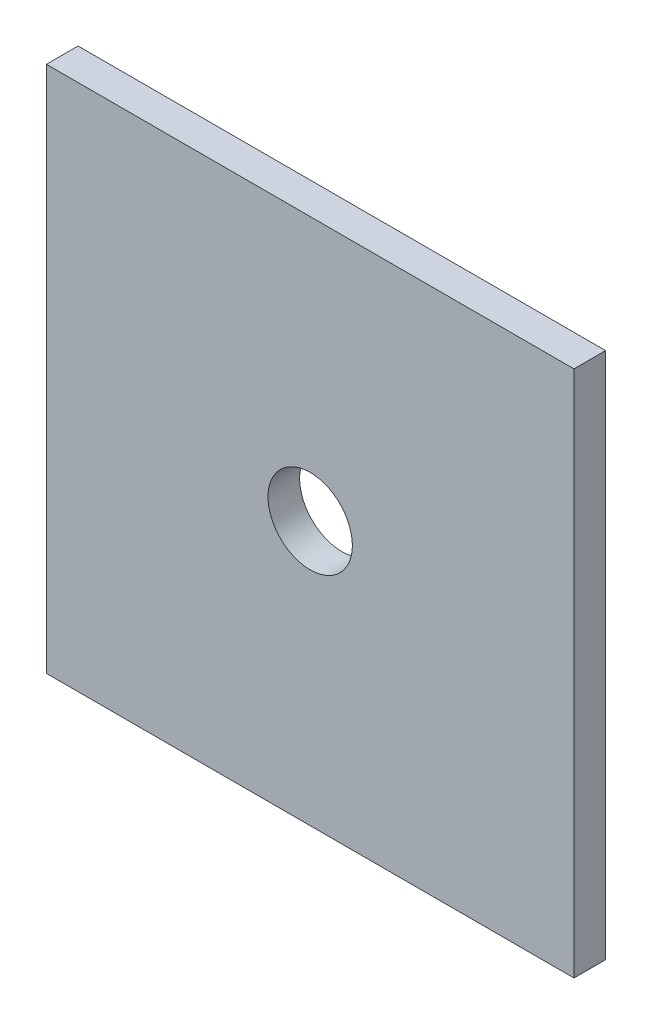
ISO-10303-21;
HEADER;
FILE_DESCRIPTION(('STEP AP214'),'2;1');
FILE_NAME('part.step','',(''),(''),'','','');
FILE_SCHEMA(('AUTOMOTIVE_DESIGN { 1 0 10303 214 1 1 1 1 }'));
ENDSEC;
DATA;
#1=APPLICATION_CONTEXT('core data for automotive mechanical design processes');
#2=APPLICATION_PROTOCOL_DEFINITION('international standard','automotive_design',2000,#1);
#3=PRODUCT_CONTEXT('',#1,'mechanical');
#4=PRODUCT('Part','Part','',(#3));
#5=PRODUCT_RELATED_PRODUCT_CATEGORY('part','',(#4));
#6=PRODUCT_DEFINITION_FORMATION('','',#4);
#7=PRODUCT_DEFINITION_CONTEXT('part definition',#1,'design');
#8=PRODUCT_DEFINITION('design','',#6,#7);
#9=PRODUCT_DEFINITION_SHAPE('','',#8);
#10=(LENGTH_UNIT() NAMED_UNIT(*) SI_UNIT(.MILLI.,.METRE.));
#11=(NAMED_UNIT(*) PLANE_ANGLE_UNIT() SI_UNIT($,.RADIAN.));
#12=(NAMED_UNIT(*) SI_UNIT($,.STERADIAN.) SOLID_ANGLE_UNIT());
#13=UNCERTAINTY_MEASURE_WITH_UNIT(LENGTH_MEASURE(1.E-05),#10,'distance_accuracy_value','');
#14=(GEOMETRIC_REPRESENTATION_CONTEXT(3) GLOBAL_UNCERTAINTY_ASSIGNED_CONTEXT((#13)) GLOBAL_UNIT_ASSIGNED_CONTEXT((#10,
#11,#12)) REPRESENTATION_CONTEXT('',''));
#15=CARTESIAN_POINT('',(0.,0.,0.));
#16=DIRECTION('',(0.,0.,1.));
#17=DIRECTION('',(1.,0.,0.));
#18=AXIS2_PLACEMENT_3D('',#15,#16,#17);
#19=CARTESIAN_POINT('',(0.,0.,3.));
#20=DIRECTION('',(0.,0.,-1.));
#21=DIRECTION('',(-1.,0.,0.));
#22=AXIS2_PLACEMENT_3D('',#19,#20,#21);
#23=PLANE('',#22);
#24=DIRECTION('',(0.,1.,0.));
#25=VECTOR('',#24,1.);
#26=CARTESIAN_POINT('',(25.,-25.,3.));
#27=LINE('',#26,#25);
#28=CARTESIAN_POINT('',(25.,-25.,3.));
#29=VERTEX_POINT('',#28);
#30=CARTESIAN_POINT('',(25.,25.,3.));
#31=VERTEX_POINT('',#30);
#32=EDGE_CURVE('E84',#29,#31,#27,.T.);
#33=ORIENTED_EDGE('',*,*,#32,.T.);
#34=DIRECTION('',(-1.,0.,0.));
#35=VECTOR('',#34,1.);
#36=CARTESIAN_POINT('',(-25.,25.,3.));
#37=LINE('',#36,#35);
#38=CARTESIAN_POINT('',(-25.,25.,3.));
#39=VERTEX_POINT('',#38);
#40=EDGE_CURVE('E79',#31,#39,#37,.T.);
#41=ORIENTED_EDGE('',*,*,#40,.T.);
#42=DIRECTION('',(0.,-1.,0.));
#43=VECTOR('',#42,1.);
#44=CARTESIAN_POINT('',(-25.,-25.,3.));
#45=LINE('',#44,#43);
#46=CARTESIAN_POINT('',(-25.,-25.,3.));
#47=VERTEX_POINT('',#46);
#48=EDGE_CURVE('E82',#39,#47,#45,.T.);
#49=ORIENTED_EDGE('',*,*,#48,.T.);
#50=DIRECTION('',(1.,0.,0.));
#51=VECTOR('',#50,1.);
#52=CARTESIAN_POINT('',(-25.,-25.,3.));
#53=LINE('',#52,#51);
#54=EDGE_CURVE('E49',#47,#29,#53,.T.);
#55=ORIENTED_EDGE('',*,*,#54,.T.);
#56=EDGE_LOOP('',(#33,#41,#49,#55));
#57=FACE_BOUND('',#56,.T.);
#58=CARTESIAN_POINT('',(0.,0.,3.));
#59=DIRECTION('',(0.,0.,1.));
#60=DIRECTION('',(1.,0.,0.));
#61=AXIS2_PLACEMENT_3D('',#58,#59,#60);
#62=CIRCLE('',#61,4.);
#63=CARTESIAN_POINT('',(4.,0.,3.));
#64=VERTEX_POINT('',#63);
#65=EDGE_CURVE('E99',#64,#64,#62,.T.);
#66=ORIENTED_EDGE('',*,*,#65,.F.);
#67=EDGE_LOOP('',(#66));
#68=FACE_BOUND('',#67,.T.);
#69=ADVANCED_FACE('F32',(#57,#68),#23,.F.);
#70=CARTESIAN_POINT('',(0.,0.,0.));
#71=DIRECTION('',(0.,0.,-1.));
#72=DIRECTION('',(-1.,0.,0.));
#73=AXIS2_PLACEMENT_3D('',#70,#71,#72);
#74=PLANE('',#73);
#75=DIRECTION('',(0.,1.,0.));
#76=VECTOR('',#75,1.);
#77=CARTESIAN_POINT('',(25.,-25.,0.));
#78=LINE('',#77,#76);
#79=CARTESIAN_POINT('',(25.,-25.,0.));
#80=VERTEX_POINT('',#79);
#81=CARTESIAN_POINT('',(25.,25.,0.));
#82=VERTEX_POINT('',#81);
#83=EDGE_CURVE('E96',#80,#82,#78,.T.);
#84=ORIENTED_EDGE('',*,*,#83,.F.);
#85=DIRECTION('',(1.,0.,0.));
#86=VECTOR('',#85,1.);
#87=CARTESIAN_POINT('',(-25.,-25.,0.));
#88=LINE('',#87,#86);
#89=CARTESIAN_POINT('',(-25.,-25.,0.));
#90=VERTEX_POINT('',#89);
#91=EDGE_CURVE('E72',#90,#80,#88,.T.);
#92=ORIENTED_EDGE('',*,*,#91,.F.);
#93=DIRECTION('',(0.,-1.,0.));
#94=VECTOR('',#93,1.);
#95=CARTESIAN_POINT('',(-25.,-25.,0.));
#96=LINE('',#95,#94);
#97=CARTESIAN_POINT('',(-25.,25.,0.));
#98=VERTEX_POINT('',#97);
#99=EDGE_CURVE('E66',#98,#90,#96,.T.);
#100=ORIENTED_EDGE('',*,*,#99,.F.);
#101=DIRECTION('',(-1.,0.,0.));
#102=VECTOR('',#101,1.);
#103=CARTESIAN_POINT('',(-25.,25.,0.));
#104=LINE('',#103,#102);
#105=EDGE_CURVE('E88',#82,#98,#104,.T.);
#106=ORIENTED_EDGE('',*,*,#105,.F.);
#107=EDGE_LOOP('',(#84,#92,#100,#106));
#108=FACE_BOUND('',#107,.T.);
#109=CARTESIAN_POINT('',(0.,0.,0.));
#110=DIRECTION('',(0.,0.,1.));
#111=DIRECTION('',(1.,0.,0.));
#112=AXIS2_PLACEMENT_3D('',#109,#110,#111);
#113=CIRCLE('',#112,4.);
#114=CARTESIAN_POINT('',(4.,0.,0.));
#115=VERTEX_POINT('',#114);
#116=EDGE_CURVE('E111',#115,#115,#113,.T.);
#117=ORIENTED_EDGE('',*,*,#116,.T.);
#118=EDGE_LOOP('',(#117));
#119=FACE_BOUND('',#118,.T.);
#120=ADVANCED_FACE('F107',(#108,#119),#74,.T.);
#121=CARTESIAN_POINT('',(25.,-25.,3.));
#122=DIRECTION('',(-1.,0.,0.));
#123=DIRECTION('',(0.,0.,1.));
#124=AXIS2_PLACEMENT_3D('',#121,#122,#123);
#125=PLANE('',#124);
#126=ORIENTED_EDGE('',*,*,#83,.T.);
#127=DIRECTION('',(0.,0.,-1.));
#128=VECTOR('',#127,1.);
#129=CARTESIAN_POINT('',(25.,25.,3.));
#130=LINE('',#129,#128);
#131=EDGE_CURVE('E11',#31,#82,#130,.T.);
#132=ORIENTED_EDGE('',*,*,#131,.F.);
#133=ORIENTED_EDGE('',*,*,#32,.F.);
#134=DIRECTION('',(0.,0.,-1.));
#135=VECTOR('',#134,1.);
#136=CARTESIAN_POINT('',(25.,-25.,3.));
#137=LINE('',#136,#135);
#138=EDGE_CURVE('E92',#29,#80,#137,.T.);
#139=ORIENTED_EDGE('',*,*,#138,.T.);
#140=EDGE_LOOP('',(#126,#132,#133,#139));
#141=FACE_BOUND('',#140,.T.);
#142=ADVANCED_FACE('F34',(#141),#125,.F.);
#143=CARTESIAN_POINT('',(-25.,25.,3.));
#144=DIRECTION('',(0.,-1.,0.));
#145=DIRECTION('',(0.,0.,-1.));
#146=AXIS2_PLACEMENT_3D('',#143,#144,#145);
#147=PLANE('',#146);
#148=ORIENTED_EDGE('',*,*,#105,.T.);
#149=DIRECTION('',(0.,0.,-1.));
#150=VECTOR('',#149,1.);
#151=CARTESIAN_POINT('',(-25.,25.,3.));
#152=LINE('',#151,#150);
#153=EDGE_CURVE('E41',#39,#98,#152,.T.);
#154=ORIENTED_EDGE('',*,*,#153,.F.);
#155=ORIENTED_EDGE('',*,*,#40,.F.);
#156=ORIENTED_EDGE('',*,*,#131,.T.);
#157=EDGE_LOOP('',(#148,#154,#155,#156));
#158=FACE_BOUND('',#157,.T.);
#159=ADVANCED_FACE('F87',(#158),#147,.F.);
#160=CARTESIAN_POINT('',(-25.,-25.,3.));
#161=DIRECTION('',(1.,0.,0.));
#162=DIRECTION('',(0.,0.,-1.));
#163=AXIS2_PLACEMENT_3D('',#160,#161,#162);
#164=PLANE('',#163);
#165=ORIENTED_EDGE('',*,*,#99,.T.);
#166=DIRECTION('',(0.,0.,-1.));
#167=VECTOR('',#166,1.);
#168=CARTESIAN_POINT('',(-25.,-25.,3.));
#169=LINE('',#168,#167);
#170=EDGE_CURVE('E89',#47,#90,#169,.T.);
#171=ORIENTED_EDGE('',*,*,#170,.F.);
#172=ORIENTED_EDGE('',*,*,#48,.F.);
#173=ORIENTED_EDGE('',*,*,#153,.T.);
#174=EDGE_LOOP('',(#165,#171,#172,#173));
#175=FACE_BOUND('',#174,.T.);
#176=ADVANCED_FACE('F90',(#175),#164,.F.);
#177=CARTESIAN_POINT('',(-25.,-25.,3.));
#178=DIRECTION('',(0.,1.,0.));
#179=DIRECTION('',(0.,0.,1.));
#180=AXIS2_PLACEMENT_3D('',#177,#178,#179);
#181=PLANE('',#180);
#182=ORIENTED_EDGE('',*,*,#91,.T.);
#183=ORIENTED_EDGE('',*,*,#138,.F.);
#184=ORIENTED_EDGE('',*,*,#54,.F.);
#185=ORIENTED_EDGE('',*,*,#170,.T.);
#186=EDGE_LOOP('',(#182,#183,#184,#185));
#187=FACE_BOUND('',#186,.T.);
#188=ADVANCED_FACE('F104',(#187),#181,.F.);
#189=CARTESIAN_POINT('',(0.,0.,3.));
#190=DIRECTION('',(0.,0.,-1.));
#191=DIRECTION('',(-1.,0.,0.));
#192=AXIS2_PLACEMENT_3D('',#189,#190,#191);
#193=CYLINDRICAL_SURFACE('',#192,4.);
#194=ORIENTED_EDGE('',*,*,#65,.T.);
#195=EDGE_LOOP('',(#194));
#196=FACE_BOUND('',#195,.T.);
#197=ORIENTED_EDGE('',*,*,#116,.F.);
#198=EDGE_LOOP('',(#197));
#199=FACE_BOUND('',#198,.T.);
#200=ADVANCED_FACE('F117',(#196,#199),#193,.F.);
#201=CLOSED_SHELL('',(#69,#120,#142,#159,#176,#188,#200));
#202=MANIFOLD_SOLID_BREP('B2',#201);
#203=ADVANCED_BREP_SHAPE_REPRESENTATION('',(#18,#202),#14);
#204=SHAPE_DEFINITION_REPRESENTATION(#9,#203);
ENDSEC;
END-ISO-10303-21;
